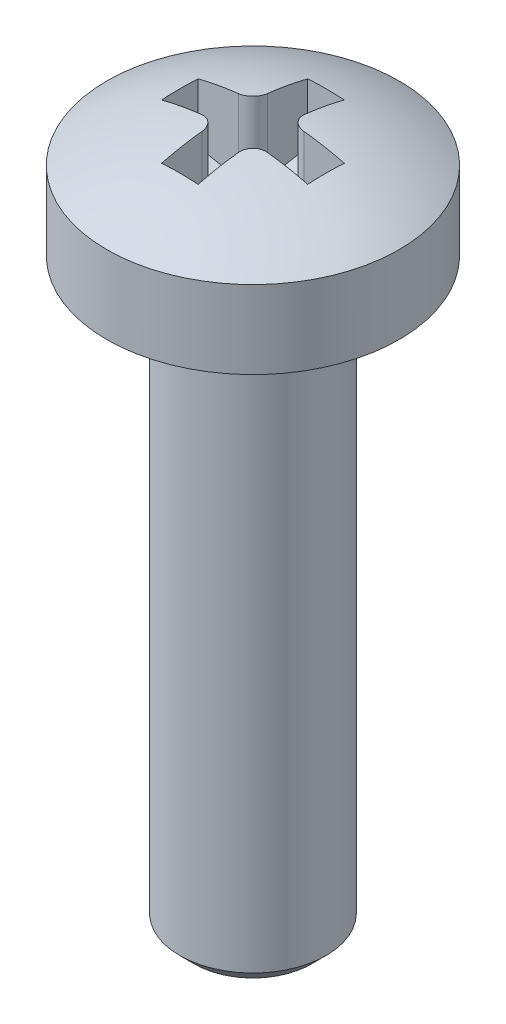
ISO-10303-21;
HEADER;
FILE_DESCRIPTION(('STEP AP214'),'2;1');
FILE_NAME('part.step','',(''),(''),'','','');
FILE_SCHEMA(('AUTOMOTIVE_DESIGN { 1 0 10303 214 1 1 1 1 }'));
ENDSEC;
DATA;
#1=APPLICATION_CONTEXT('core data for automotive mechanical design processes');
#2=APPLICATION_PROTOCOL_DEFINITION('international standard','automotive_design',2000,#1);
#3=PRODUCT_CONTEXT('',#1,'mechanical');
#4=PRODUCT('Part','Part','',(#3));
#5=PRODUCT_RELATED_PRODUCT_CATEGORY('part','',(#4));
#6=PRODUCT_DEFINITION_FORMATION('','',#4);
#7=PRODUCT_DEFINITION_CONTEXT('part definition',#1,'design');
#8=PRODUCT_DEFINITION('design','',#6,#7);
#9=PRODUCT_DEFINITION_SHAPE('','',#8);
#10=(LENGTH_UNIT() NAMED_UNIT(*) SI_UNIT(.MILLI.,.METRE.));
#11=(NAMED_UNIT(*) PLANE_ANGLE_UNIT() SI_UNIT($,.RADIAN.));
#12=(NAMED_UNIT(*) SI_UNIT($,.STERADIAN.) SOLID_ANGLE_UNIT());
#13=UNCERTAINTY_MEASURE_WITH_UNIT(LENGTH_MEASURE(1.E-05),#10,'distance_accuracy_value','');
#14=(GEOMETRIC_REPRESENTATION_CONTEXT(3) GLOBAL_UNCERTAINTY_ASSIGNED_CONTEXT((#13)) GLOBAL_UNIT_ASSIGNED_CONTEXT((#10,
#11,#12)) REPRESENTATION_CONTEXT('',''));
#15=CARTESIAN_POINT('',(0.,0.,0.));
#16=DIRECTION('',(0.,0.,1.));
#17=DIRECTION('',(1.,0.,0.));
#18=AXIS2_PLACEMENT_3D('',#15,#16,#17);
#19=CARTESIAN_POINT('',(1.5,-12.,0.));
#20=DIRECTION('',(0.,1.,0.));
#21=DIRECTION('',(0.,0.,1.));
#22=AXIS2_PLACEMENT_3D('',#19,#20,#21);
#23=PLANE('',#22);
#24=CARTESIAN_POINT('',(0.,-12.,0.));
#25=DIRECTION('',(0.,1.,0.));
#26=DIRECTION('',(0.,0.,1.));
#27=AXIS2_PLACEMENT_3D('',#24,#25,#26);
#28=CIRCLE('',#27,1.2);
#29=CARTESIAN_POINT('',(0.,-12.,1.2));
#30=VERTEX_POINT('',#29);
#31=EDGE_CURVE('E11',#30,#30,#28,.F.);
#32=ORIENTED_EDGE('',*,*,#31,.T.);
#33=EDGE_LOOP('',(#32));
#34=FACE_BOUND('',#33,.T.);
#35=ADVANCED_FACE('F37',(#34),#23,.F.);
#36=CARTESIAN_POINT('',(0.,-3.62500000000001,0.));
#37=DIRECTION('',(0.,1.,0.));
#38=DIRECTION('',(1.,0.,0.));
#39=AXIS2_PLACEMENT_3D('',#36,#37,#38);
#40=SPHERICAL_SURFACE('',#39,6.02500000000001);
#41=CARTESIAN_POINT('',(0.375,-3.62500000000001,0.));
#42=DIRECTION('',(1.,0.,0.));
#43=DIRECTION('',(0.,0.,-1.));
#44=AXIS2_PLACEMENT_3D('',#41,#42,#43);
#45=CIRCLE('',#44,6.01331855134917);
#46=CARTESIAN_POINT('',(0.375,2.19822934461627,-1.5));
#47=VERTEX_POINT('',#46);
#48=CARTESIAN_POINT('',(0.375,2.35031379929121,-0.675));
#49=VERTEX_POINT('',#48);
#50=EDGE_CURVE('E195',#47,#49,#45,.T.);
#51=ORIENTED_EDGE('',*,*,#50,.T.);
#52=CARTESIAN_POINT('',(0.375,2.35031379929121,-0.675));
#53=CARTESIAN_POINT('',(0.374985349417381,2.35220444615528,-0.658277956372581));
#54=CARTESIAN_POINT('',(0.376397398992253,2.35393496074945,-0.641538977654202));
#55=CARTESIAN_POINT('',(0.381987637635008,2.35703276253778,-0.608502344680983));
#56=CARTESIAN_POINT('',(0.386164616673404,2.3584002082569,-0.592204500616442));
#57=CARTESIAN_POINT('',(0.397201767549696,2.36073151910796,-0.560497890339847));
#58=CARTESIAN_POINT('',(0.404063968155696,2.36169507794809,-0.54508980649399));
#59=CARTESIAN_POINT('',(0.420278633306388,2.3631885302197,-0.515627806387893));
#60=CARTESIAN_POINT('',(0.429630327307517,2.36371855763068,-0.501573472947157));
#61=CARTESIAN_POINT('',(0.450489734779432,2.3643271631073,-0.475314136043546));
#62=CARTESIAN_POINT('',(0.461982277261607,2.36440880162246,-0.463097150651167));
#63=CARTESIAN_POINT('',(0.486839207376879,2.36412637906618,-0.440746151760645));
#64=CARTESIAN_POINT('',(0.500203884200747,2.36376224906896,-0.430612460669295));
#65=CARTESIAN_POINT('',(0.528375551845275,2.36260097750676,-0.412742868154042));
#66=CARTESIAN_POINT('',(0.543178165558437,2.36180511820399,-0.40499997225592));
#67=CARTESIAN_POINT('',(0.573836425325766,2.35980454599236,-0.392082493800712));
#68=CARTESIAN_POINT('',(0.589691658381626,2.35859999268216,-0.38690691062456));
#69=CARTESIAN_POINT('',(0.617185195118467,2.35623282056287,-0.380392504975069));
#70=CARTESIAN_POINT('',(0.628674838536786,2.35516432503431,-0.378370330785825));
#71=CARTESIAN_POINT('',(0.651777921121526,2.35286050821514,-0.375673982210861));
#72=CARTESIAN_POINT('',(0.663391159511301,2.35162542794527,-0.374997882148386));
#73=CARTESIAN_POINT('',(0.675,2.35031379929121,-0.375));
#74=B_SPLINE_CURVE_WITH_KNOTS('',3,(#52,#53,#54,#55,#56,#57,#58,#59,#60,#61,#62,#63,#64,#65,#66,
#67,#68,#69,#70,#71,#72,#73),.UNSPECIFIED.,.F.,.F.,(4,2,2,2,2,2,2,2,2,2,4),(0.,
0.0504243081052717,0.100826563352769,0.151266972820674,0.201691788178594,0.251772000476645,
0.30185995727157,0.351799957856257,0.401720478828299,0.436790510548682,0.47181033536791),.UNSPECIFIED.);
#75=CARTESIAN_POINT('',(0.675,2.35031379929121,-0.375));
#76=VERTEX_POINT('',#75);
#77=EDGE_CURVE('E257',#49,#76,#74,.T.);
#78=ORIENTED_EDGE('',*,*,#77,.T.);
#79=CARTESIAN_POINT('',(0.,-3.62500000000001,-0.375));
#80=DIRECTION('',(0.,0.,-1.));
#81=DIRECTION('',(-1.,0.,0.));
#82=AXIS2_PLACEMENT_3D('',#79,#80,#81);
#83=CIRCLE('',#82,6.01331855134917);
#84=CARTESIAN_POINT('',(1.5,2.19822934461627,-0.375));
#85=VERTEX_POINT('',#84);
#86=EDGE_CURVE('E193',#76,#85,#83,.T.);
#87=ORIENTED_EDGE('',*,*,#86,.T.);
#88=CARTESIAN_POINT('',(1.5,-3.62500000000001,0.));
#89=DIRECTION('',(1.,0.,0.));
#90=DIRECTION('',(0.,0.,-1.));
#91=AXIS2_PLACEMENT_3D('',#88,#89,#90);
#92=CIRCLE('',#91,5.83529133805675);
#93=CARTESIAN_POINT('',(1.5,2.19822934461627,0.375));
#94=VERTEX_POINT('',#93);
#95=EDGE_CURVE('E170',#85,#94,#92,.T.);
#96=ORIENTED_EDGE('',*,*,#95,.T.);
#97=CARTESIAN_POINT('',(0.,-3.62500000000001,0.375));
#98=DIRECTION('',(0.,0.,1.));
#99=DIRECTION('',(1.,0.,0.));
#100=AXIS2_PLACEMENT_3D('',#97,#98,#99);
#101=CIRCLE('',#100,6.01331855134917);
#102=CARTESIAN_POINT('',(0.675,2.35031379929121,0.375));
#103=VERTEX_POINT('',#102);
#104=EDGE_CURVE('E219',#94,#103,#101,.T.);
#105=ORIENTED_EDGE('',*,*,#104,.T.);
#106=CARTESIAN_POINT('',(0.675,2.35031379929121,0.375));
#107=CARTESIAN_POINT('',(0.658277956372581,2.35220444615528,0.374985349417381));
#108=CARTESIAN_POINT('',(0.641538977654202,2.35393496074945,0.376397398992254));
#109=CARTESIAN_POINT('',(0.608502344680983,2.35703276253778,0.381987637635009));
#110=CARTESIAN_POINT('',(0.592204500616442,2.3584002082569,0.386164616673404));
#111=CARTESIAN_POINT('',(0.560497890339847,2.36073151910796,0.397201767549697));
#112=CARTESIAN_POINT('',(0.54508980649399,2.36169507794809,0.404063968155696));
#113=CARTESIAN_POINT('',(0.515627806387893,2.3631885302197,0.420278633306388));
#114=CARTESIAN_POINT('',(0.501573472947157,2.36371855763068,0.429630327307518));
#115=CARTESIAN_POINT('',(0.475314136043546,2.3643271631073,0.450489734779433));
#116=CARTESIAN_POINT('',(0.463097150651167,2.36440880162246,0.461982277261608));
#117=CARTESIAN_POINT('',(0.440746151760645,2.36412637906618,0.48683920737688));
#118=CARTESIAN_POINT('',(0.430612460669295,2.36376224906896,0.500203884200747));
#119=CARTESIAN_POINT('',(0.412742868154042,2.36260097750676,0.528375551845275));
#120=CARTESIAN_POINT('',(0.40499997225592,2.36180511820399,0.543178165558437));
#121=CARTESIAN_POINT('',(0.392082493800712,2.35980454599236,0.573836425325766));
#122=CARTESIAN_POINT('',(0.38690691062456,2.35859999268216,0.589691658381626));
#123=CARTESIAN_POINT('',(0.380392504975069,2.35623282056287,0.617185195118467));
#124=CARTESIAN_POINT('',(0.378370330785825,2.35516432503431,0.628674838536786));
#125=CARTESIAN_POINT('',(0.375673982210861,2.35286050821514,0.651777921121527));
#126=CARTESIAN_POINT('',(0.374997882148386,2.35162542794527,0.663391159511301));
#127=CARTESIAN_POINT('',(0.375,2.35031379929121,0.675));
#128=B_SPLINE_CURVE_WITH_KNOTS('',3,(#106,#107,#108,#109,#110,#111,#112,#113,#114,#115,#116,
#117,#118,#119,#120,#121,#122,#123,#124,#125,#126,#127),.UNSPECIFIED.,.F.,.F.,(4,2,2,2,2,2,2,2,
2,2,4),(0.,0.0504243081052716,0.100826563352769,0.151266972820674,0.201691788178594,
0.251772000476645,0.30185995727157,0.351799957856257,0.401720478828299,0.436790510548682,
0.47181033536791),.UNSPECIFIED.);
#129=CARTESIAN_POINT('',(0.375,2.35031379929121,0.675));
#130=VERTEX_POINT('',#129);
#131=EDGE_CURVE('E252',#103,#130,#128,.T.);
#132=ORIENTED_EDGE('',*,*,#131,.T.);
#133=CARTESIAN_POINT('',(0.375,-3.62500000000001,0.));
#134=DIRECTION('',(1.,0.,0.));
#135=DIRECTION('',(0.,0.,-1.));
#136=AXIS2_PLACEMENT_3D('',#133,#134,#135);
#137=CIRCLE('',#136,6.01331855134917);
#138=CARTESIAN_POINT('',(0.375,2.19822934461627,1.5));
#139=VERTEX_POINT('',#138);
#140=EDGE_CURVE('E217',#130,#139,#137,.T.);
#141=ORIENTED_EDGE('',*,*,#140,.T.);
#142=CARTESIAN_POINT('',(0.,-3.62500000000001,1.5));
#143=DIRECTION('',(0.,0.,1.));
#144=DIRECTION('',(1.,0.,0.));
#145=AXIS2_PLACEMENT_3D('',#142,#143,#144);
#146=CIRCLE('',#145,5.83529133805675);
#147=CARTESIAN_POINT('',(-0.375,2.19822934461627,1.5));
#148=VERTEX_POINT('',#147);
#149=EDGE_CURVE('E214',#139,#148,#146,.T.);
#150=ORIENTED_EDGE('',*,*,#149,.T.);
#151=CARTESIAN_POINT('',(-0.375,-3.62500000000001,0.));
#152=DIRECTION('',(-1.,0.,0.));
#153=DIRECTION('',(0.,0.,1.));
#154=AXIS2_PLACEMENT_3D('',#151,#152,#153);
#155=CIRCLE('',#154,6.01331855134917);
#156=CARTESIAN_POINT('',(-0.375,2.35031379929121,0.675));
#157=VERTEX_POINT('',#156);
#158=EDGE_CURVE('E211',#148,#157,#155,.T.);
#159=ORIENTED_EDGE('',*,*,#158,.T.);
#160=CARTESIAN_POINT('',(-0.375,2.35031379929121,0.675));
#161=CARTESIAN_POINT('',(-0.374985349417381,2.35220444615528,0.658277956372581));
#162=CARTESIAN_POINT('',(-0.376397398992254,2.35393496074945,0.641538977654203));
#163=CARTESIAN_POINT('',(-0.381987637635009,2.35703276253778,0.608502344680983));
#164=CARTESIAN_POINT('',(-0.386164616673404,2.3584002082569,0.592204500616442));
#165=CARTESIAN_POINT('',(-0.397201767549697,2.36073151910796,0.560497890339847));
#166=CARTESIAN_POINT('',(-0.404063968155696,2.36169507794809,0.545089806493991));
#167=CARTESIAN_POINT('',(-0.420278633306388,2.3631885302197,0.515627806387893));
#168=CARTESIAN_POINT('',(-0.429630327307518,2.36371855763068,0.501573472947157));
#169=CARTESIAN_POINT('',(-0.450489734779433,2.3643271631073,0.475314136043547));
#170=CARTESIAN_POINT('',(-0.461982277261608,2.36440880162246,0.463097150651168));
#171=CARTESIAN_POINT('',(-0.48683920737688,2.36412637906618,0.440746151760645));
#172=CARTESIAN_POINT('',(-0.500203884200747,2.36376224906896,0.430612460669295));
#173=CARTESIAN_POINT('',(-0.528375551845275,2.36260097750676,0.412742868154042));
#174=CARTESIAN_POINT('',(-0.543178165558437,2.36180511820399,0.40499997225592));
#175=CARTESIAN_POINT('',(-0.573836425325766,2.35980454599236,0.392082493800713));
#176=CARTESIAN_POINT('',(-0.589691658381626,2.35859999268216,0.38690691062456));
#177=CARTESIAN_POINT('',(-0.617185195118467,2.35623282056287,0.380392504975069));
#178=CARTESIAN_POINT('',(-0.628674838536786,2.35516432503431,0.378370330785826));
#179=CARTESIAN_POINT('',(-0.651777921121527,2.35286050821514,0.375673982210861));
#180=CARTESIAN_POINT('',(-0.663391159511301,2.35162542794527,0.374997882148387));
#181=CARTESIAN_POINT('',(-0.675,2.35031379929121,0.375));
#182=B_SPLINE_CURVE_WITH_KNOTS('',3,(#160,#161,#162,#163,#164,#165,#166,#167,#168,#169,#170,
#171,#172,#173,#174,#175,#176,#177,#178,#179,#180,#181),.UNSPECIFIED.,.F.,.F.,(4,2,2,2,2,2,2,2,
2,2,4),(0.,0.0504243081052716,0.100826563352769,0.151266972820674,0.201691788178594,
0.251772000476645,0.30185995727157,0.351799957856257,0.401720478828299,0.436790510548682,
0.47181033536791),.UNSPECIFIED.);
#183=CARTESIAN_POINT('',(-0.675,2.35031379929121,0.375));
#184=VERTEX_POINT('',#183);
#185=EDGE_CURVE('E231',#157,#184,#182,.T.);
#186=ORIENTED_EDGE('',*,*,#185,.T.);
#187=CARTESIAN_POINT('',(0.,-3.62500000000001,0.375));
#188=DIRECTION('',(0.,0.,1.));
#189=DIRECTION('',(1.,0.,0.));
#190=AXIS2_PLACEMENT_3D('',#187,#188,#189);
#191=CIRCLE('',#190,6.01331855134917);
#192=CARTESIAN_POINT('',(-1.5,2.19822934461627,0.375));
#193=VERTEX_POINT('',#192);
#194=EDGE_CURVE('E209',#184,#193,#191,.T.);
#195=ORIENTED_EDGE('',*,*,#194,.T.);
#196=CARTESIAN_POINT('',(-1.5,-3.62500000000001,0.));
#197=DIRECTION('',(-1.,0.,0.));
#198=DIRECTION('',(0.,0.,1.));
#199=AXIS2_PLACEMENT_3D('',#196,#197,#198);
#200=CIRCLE('',#199,5.83529133805675);
#201=CARTESIAN_POINT('',(-1.5,2.19822934461627,-0.375));
#202=VERTEX_POINT('',#201);
#203=EDGE_CURVE('E206',#193,#202,#200,.T.);
#204=ORIENTED_EDGE('',*,*,#203,.T.);
#205=CARTESIAN_POINT('',(0.,-3.62500000000001,-0.375));
#206=DIRECTION('',(0.,0.,-1.));
#207=DIRECTION('',(-1.,0.,0.));
#208=AXIS2_PLACEMENT_3D('',#205,#206,#207);
#209=CIRCLE('',#208,6.01331855134917);
#210=CARTESIAN_POINT('',(-0.675,2.35031379929121,-0.375));
#211=VERTEX_POINT('',#210);
#212=EDGE_CURVE('E203',#202,#211,#209,.T.);
#213=ORIENTED_EDGE('',*,*,#212,.T.);
#214=CARTESIAN_POINT('',(-0.675,2.35031379929121,-0.375));
#215=CARTESIAN_POINT('',(-0.658277956372581,2.35220444615528,-0.374985349417381));
#216=CARTESIAN_POINT('',(-0.641538977654203,2.35393496074945,-0.376397398992253));
#217=CARTESIAN_POINT('',(-0.608502344680983,2.35703276253778,-0.381987637635008));
#218=CARTESIAN_POINT('',(-0.592204500616442,2.3584002082569,-0.386164616673404));
#219=CARTESIAN_POINT('',(-0.560497890339847,2.36073151910796,-0.397201767549696));
#220=CARTESIAN_POINT('',(-0.545089806493991,2.36169507794809,-0.404063968155695));
#221=CARTESIAN_POINT('',(-0.515627806387893,2.3631885302197,-0.420278633306388));
#222=CARTESIAN_POINT('',(-0.501573472947157,2.36371855763068,-0.429630327307517));
#223=CARTESIAN_POINT('',(-0.475314136043547,2.3643271631073,-0.450489734779432));
#224=CARTESIAN_POINT('',(-0.463097150651168,2.36440880162246,-0.461982277261607));
#225=CARTESIAN_POINT('',(-0.440746151760646,2.36412637906618,-0.486839207376879));
#226=CARTESIAN_POINT('',(-0.430612460669295,2.36376224906896,-0.500203884200747));
#227=CARTESIAN_POINT('',(-0.412742868154042,2.36260097750676,-0.528375551845275));
#228=CARTESIAN_POINT('',(-0.40499997225592,2.36180511820399,-0.543178165558437));
#229=CARTESIAN_POINT('',(-0.392082493800713,2.35980454599236,-0.573836425325766));
#230=CARTESIAN_POINT('',(-0.38690691062456,2.35859999268216,-0.589691658381626));
#231=CARTESIAN_POINT('',(-0.380392504975069,2.35623282056287,-0.617185195118466));
#232=CARTESIAN_POINT('',(-0.378370330785826,2.35516432503431,-0.628674838536786));
#233=CARTESIAN_POINT('',(-0.375673982210861,2.35286050821514,-0.651777921121526));
#234=CARTESIAN_POINT('',(-0.374997882148387,2.35162542794527,-0.6633911595113));
#235=CARTESIAN_POINT('',(-0.375,2.35031379929121,-0.675));
#236=B_SPLINE_CURVE_WITH_KNOTS('',3,(#214,#215,#216,#217,#218,#219,#220,#221,#222,#223,#224,
#225,#226,#227,#228,#229,#230,#231,#232,#233,#234,#235),.UNSPECIFIED.,.F.,.F.,(4,2,2,2,2,2,2,2,
2,2,4),(0.,0.0504243081052717,0.100826563352769,0.151266972820674,0.201691788178594,
0.251772000476645,0.30185995727157,0.351799957856257,0.401720478828299,0.436790510548682,
0.47181033536791),.UNSPECIFIED.);
#237=CARTESIAN_POINT('',(-0.375,2.35031379929121,-0.675));
#238=VERTEX_POINT('',#237);
#239=EDGE_CURVE('E225',#211,#238,#236,.T.);
#240=ORIENTED_EDGE('',*,*,#239,.T.);
#241=CARTESIAN_POINT('',(-0.375,-3.62500000000001,0.));
#242=DIRECTION('',(-1.,0.,0.));
#243=DIRECTION('',(0.,0.,1.));
#244=AXIS2_PLACEMENT_3D('',#241,#242,#243);
#245=CIRCLE('',#244,6.01331855134917);
#246=CARTESIAN_POINT('',(-0.375,2.19822934461627,-1.5));
#247=VERTEX_POINT('',#246);
#248=EDGE_CURVE('E201',#238,#247,#245,.T.);
#249=ORIENTED_EDGE('',*,*,#248,.T.);
#250=CARTESIAN_POINT('',(0.,-3.62500000000001,-1.5));
#251=DIRECTION('',(0.,0.,-1.));
#252=DIRECTION('',(-1.,0.,0.));
#253=AXIS2_PLACEMENT_3D('',#250,#251,#252);
#254=CIRCLE('',#253,5.83529133805675);
#255=EDGE_CURVE('E198',#247,#47,#254,.T.);
#256=ORIENTED_EDGE('',*,*,#255,.T.);
#257=EDGE_LOOP('',(#51,#78,#87,#96,#105,#132,#141,#150,#159,#186,#195,#204,#213,#240,#249,#256));
#258=FACE_BOUND('',#257,.T.);
#259=CARTESIAN_POINT('',(0.,1.6,0.));
#260=DIRECTION('',(0.,1.,0.));
#261=DIRECTION('',(0.,0.,1.));
#262=AXIS2_PLACEMENT_3D('',#259,#260,#261);
#263=CIRCLE('',#262,3.);
#264=CARTESIAN_POINT('',(0.,1.6,3.));
#265=VERTEX_POINT('',#264);
#266=EDGE_CURVE('E189',#265,#265,#263,.T.);
#267=ORIENTED_EDGE('',*,*,#266,.T.);
#268=EDGE_LOOP('',(#267));
#269=FACE_BOUND('',#268,.T.);
#270=ADVANCED_FACE('F239',(#258,#269),#40,.T.);
#271=CARTESIAN_POINT('',(0.,2.4,0.));
#272=DIRECTION('',(0.,1.,0.));
#273=DIRECTION('',(0.,0.,1.));
#274=AXIS2_PLACEMENT_3D('',#271,#272,#273);
#275=CYLINDRICAL_SURFACE('',#274,3.);
#276=ORIENTED_EDGE('',*,*,#266,.F.);
#277=EDGE_LOOP('',(#276));
#278=FACE_BOUND('',#277,.T.);
#279=CARTESIAN_POINT('',(0.,0.,0.));
#280=DIRECTION('',(0.,1.,0.));
#281=DIRECTION('',(0.,0.,1.));
#282=AXIS2_PLACEMENT_3D('',#279,#280,#281);
#283=CIRCLE('',#282,3.);
#284=CARTESIAN_POINT('',(0.,0.,3.));
#285=VERTEX_POINT('',#284);
#286=EDGE_CURVE('E181',#285,#285,#283,.T.);
#287=ORIENTED_EDGE('',*,*,#286,.T.);
#288=EDGE_LOOP('',(#287));
#289=FACE_BOUND('',#288,.T.);
#290=ADVANCED_FACE('F244',(#278,#289),#275,.T.);
#291=CARTESIAN_POINT('',(3.,0.,0.));
#292=DIRECTION('',(0.,1.,0.));
#293=DIRECTION('',(0.,0.,1.));
#294=AXIS2_PLACEMENT_3D('',#291,#292,#293);
#295=PLANE('',#294);
#296=ORIENTED_EDGE('',*,*,#286,.F.);
#297=EDGE_LOOP('',(#296));
#298=FACE_BOUND('',#297,.T.);
#299=CARTESIAN_POINT('',(0.,0.,0.));
#300=DIRECTION('',(0.,1.,0.));
#301=DIRECTION('',(0.,0.,1.));
#302=AXIS2_PLACEMENT_3D('',#299,#300,#301);
#303=CIRCLE('',#302,1.5);
#304=CARTESIAN_POINT('',(0.,0.,1.5));
#305=VERTEX_POINT('',#304);
#306=EDGE_CURVE('E178',#305,#305,#303,.T.);
#307=ORIENTED_EDGE('',*,*,#306,.T.);
#308=EDGE_LOOP('',(#307));
#309=FACE_BOUND('',#308,.T.);
#310=ADVANCED_FACE('F331',(#298,#309),#295,.F.);
#311=CARTESIAN_POINT('',(0.,2.4,0.));
#312=DIRECTION('',(0.,1.,0.));
#313=DIRECTION('',(0.,0.,1.));
#314=AXIS2_PLACEMENT_3D('',#311,#312,#313);
#315=CYLINDRICAL_SURFACE('',#314,1.5);
#316=CARTESIAN_POINT('',(0.,-11.7,0.));
#317=DIRECTION('',(0.,1.,0.));
#318=DIRECTION('',(0.,0.,1.));
#319=AXIS2_PLACEMENT_3D('',#316,#317,#318);
#320=CIRCLE('',#319,1.5);
#321=CARTESIAN_POINT('',(0.,-11.7,1.5));
#322=VERTEX_POINT('',#321);
#323=EDGE_CURVE('E45',#322,#322,#320,.T.);
#324=ORIENTED_EDGE('',*,*,#323,.T.);
#325=EDGE_LOOP('',(#324));
#326=FACE_BOUND('',#325,.T.);
#327=ORIENTED_EDGE('',*,*,#306,.F.);
#328=EDGE_LOOP('',(#327));
#329=FACE_BOUND('',#328,.T.);
#330=ADVANCED_FACE('F303',(#326,#329),#315,.T.);
#331=CARTESIAN_POINT('',(0.375,-12.001,0.375));
#332=DIRECTION('',(0.,0.,1.));
#333=DIRECTION('',(1.,0.,0.));
#334=AXIS2_PLACEMENT_3D('',#331,#332,#333);
#335=PLANE('',#334);
#336=CARTESIAN_POINT('',(0.,6.82500000000003,0.375));
#337=DIRECTION('',(0.,0.,1.));
#338=DIRECTION('',(1.,0.,0.));
#339=AXIS2_PLACEMENT_3D('',#336,#337,#338);
#340=CIRCLE('',#339,6.01331855134919);
#341=CARTESIAN_POINT('',(1.5,1.00177065538373,0.375));
#342=VERTEX_POINT('',#341);
#343=CARTESIAN_POINT('',(0.675,0.849686200708785,0.375));
#344=VERTEX_POINT('',#343);
#345=EDGE_CURVE('E176',#342,#344,#340,.F.);
#346=ORIENTED_EDGE('',*,*,#345,.T.);
#347=DIRECTION('',(0.,1.,0.));
#348=VECTOR('',#347,1.);
#349=CARTESIAN_POINT('',(0.675,-12.001,0.375));
#350=LINE('',#349,#348);
#351=EDGE_CURVE('E556',#344,#103,#350,.T.);
#352=ORIENTED_EDGE('',*,*,#351,.T.);
#353=ORIENTED_EDGE('',*,*,#104,.F.);
#354=DIRECTION('',(0.,1.,0.));
#355=VECTOR('',#354,1.);
#356=CARTESIAN_POINT('',(1.5,-12.001,0.375));
#357=LINE('',#356,#355);
#358=EDGE_CURVE('E172',#342,#94,#357,.T.);
#359=ORIENTED_EDGE('',*,*,#358,.F.);
#360=EDGE_LOOP('',(#346,#352,#353,#359));
#361=FACE_BOUND('',#360,.T.);
#362=ADVANCED_FACE('F344',(#361),#335,.F.);
#363=CARTESIAN_POINT('',(0.375,-12.001,0.375));
#364=DIRECTION('',(1.,0.,0.));
#365=DIRECTION('',(0.,0.,-1.));
#366=AXIS2_PLACEMENT_3D('',#363,#364,#365);
#367=PLANE('',#366);
#368=ORIENTED_EDGE('',*,*,#140,.F.);
#369=DIRECTION('',(0.,1.,0.));
#370=VECTOR('',#369,1.);
#371=CARTESIAN_POINT('',(0.375,-12.001,0.675));
#372=LINE('',#371,#370);
#373=CARTESIAN_POINT('',(0.375,0.849686200708785,0.675));
#374=VERTEX_POINT('',#373);
#375=EDGE_CURVE('E554',#130,#374,#372,.F.);
#376=ORIENTED_EDGE('',*,*,#375,.T.);
#377=CARTESIAN_POINT('',(0.375,6.82500000000003,0.));
#378=DIRECTION('',(1.,0.,0.));
#379=DIRECTION('',(0.,0.,-1.));
#380=AXIS2_PLACEMENT_3D('',#377,#378,#379);
#381=CIRCLE('',#380,6.01331855134919);
#382=CARTESIAN_POINT('',(0.375,1.00177065538373,1.5));
#383=VERTEX_POINT('',#382);
#384=EDGE_CURVE('E183',#374,#383,#381,.F.);
#385=ORIENTED_EDGE('',*,*,#384,.T.);
#386=DIRECTION('',(0.,1.,0.));
#387=VECTOR('',#386,1.);
#388=CARTESIAN_POINT('',(0.375,-12.001,1.5));
#389=LINE('',#388,#387);
#390=EDGE_CURVE('E162',#383,#139,#389,.T.);
#391=ORIENTED_EDGE('',*,*,#390,.T.);
#392=EDGE_LOOP('',(#368,#376,#385,#391));
#393=FACE_BOUND('',#392,.T.);
#394=ADVANCED_FACE('F292',(#393),#367,.F.);
#395=CARTESIAN_POINT('',(-0.375,-12.001,1.5));
#396=DIRECTION('',(0.,0.,1.));
#397=DIRECTION('',(1.,0.,0.));
#398=AXIS2_PLACEMENT_3D('',#395,#396,#397);
#399=PLANE('',#398);
#400=ORIENTED_EDGE('',*,*,#390,.F.);
#401=CARTESIAN_POINT('',(0.,6.82500000000003,1.5));
#402=DIRECTION('',(0.,0.,1.));
#403=DIRECTION('',(1.,0.,0.));
#404=AXIS2_PLACEMENT_3D('',#401,#402,#403);
#405=CIRCLE('',#404,5.83529133805677);
#406=CARTESIAN_POINT('',(-0.375,1.00177065538373,1.5));
#407=VERTEX_POINT('',#406);
#408=EDGE_CURVE('E518',#383,#407,#405,.F.);
#409=ORIENTED_EDGE('',*,*,#408,.T.);
#410=DIRECTION('',(0.,1.,0.));
#411=VECTOR('',#410,1.);
#412=CARTESIAN_POINT('',(-0.375,-12.001,1.5));
#413=LINE('',#412,#411);
#414=EDGE_CURVE('E517',#407,#148,#413,.T.);
#415=ORIENTED_EDGE('',*,*,#414,.T.);
#416=ORIENTED_EDGE('',*,*,#149,.F.);
#417=EDGE_LOOP('',(#400,#409,#415,#416));
#418=FACE_BOUND('',#417,.T.);
#419=ADVANCED_FACE('F357',(#418),#399,.F.);
#420=CARTESIAN_POINT('',(-0.375,-12.001,0.375));
#421=DIRECTION('',(-1.,0.,0.));
#422=DIRECTION('',(0.,0.,1.));
#423=AXIS2_PLACEMENT_3D('',#420,#421,#422);
#424=PLANE('',#423);
#425=CARTESIAN_POINT('',(-0.375,6.82500000000003,0.));
#426=DIRECTION('',(-1.,0.,0.));
#427=DIRECTION('',(0.,0.,1.));
#428=AXIS2_PLACEMENT_3D('',#425,#426,#427);
#429=CIRCLE('',#428,6.01331855134919);
#430=CARTESIAN_POINT('',(-0.375,0.849686200708785,0.675));
#431=VERTEX_POINT('',#430);
#432=EDGE_CURVE('E512',#407,#431,#429,.F.);
#433=ORIENTED_EDGE('',*,*,#432,.T.);
#434=DIRECTION('',(0.,1.,0.));
#435=VECTOR('',#434,1.);
#436=CARTESIAN_POINT('',(-0.375,-12.001,0.675));
#437=LINE('',#436,#435);
#438=EDGE_CURVE('E507',#431,#157,#437,.T.);
#439=ORIENTED_EDGE('',*,*,#438,.T.);
#440=ORIENTED_EDGE('',*,*,#158,.F.);
#441=ORIENTED_EDGE('',*,*,#414,.F.);
#442=EDGE_LOOP('',(#433,#439,#440,#441));
#443=FACE_BOUND('',#442,.T.);
#444=ADVANCED_FACE('F364',(#443),#424,.F.);
#445=CARTESIAN_POINT('',(-1.5,-12.001,0.375));
#446=DIRECTION('',(0.,0.,1.));
#447=DIRECTION('',(1.,0.,0.));
#448=AXIS2_PLACEMENT_3D('',#445,#446,#447);
#449=PLANE('',#448);
#450=ORIENTED_EDGE('',*,*,#194,.F.);
#451=DIRECTION('',(0.,1.,0.));
#452=VECTOR('',#451,1.);
#453=CARTESIAN_POINT('',(-0.675,-12.001,0.375));
#454=LINE('',#453,#452);
#455=CARTESIAN_POINT('',(-0.675,0.849686200708785,0.375));
#456=VERTEX_POINT('',#455);
#457=EDGE_CURVE('E505',#184,#456,#454,.F.);
#458=ORIENTED_EDGE('',*,*,#457,.T.);
#459=CARTESIAN_POINT('',(0.,6.82500000000003,0.375));
#460=DIRECTION('',(0.,0.,1.));
#461=DIRECTION('',(1.,0.,0.));
#462=AXIS2_PLACEMENT_3D('',#459,#460,#461);
#463=CIRCLE('',#462,6.01331855134919);
#464=CARTESIAN_POINT('',(-1.5,1.00177065538373,0.375));
#465=VERTEX_POINT('',#464);
#466=EDGE_CURVE('E515',#456,#465,#463,.F.);
#467=ORIENTED_EDGE('',*,*,#466,.T.);
#468=DIRECTION('',(0.,1.,0.));
#469=VECTOR('',#468,1.);
#470=CARTESIAN_POINT('',(-1.5,-12.001,0.375));
#471=LINE('',#470,#469);
#472=EDGE_CURVE('E529',#465,#193,#471,.T.);
#473=ORIENTED_EDGE('',*,*,#472,.T.);
#474=EDGE_LOOP('',(#450,#458,#467,#473));
#475=FACE_BOUND('',#474,.T.);
#476=ADVANCED_FACE('F371',(#475),#449,.F.);
#477=CARTESIAN_POINT('',(-1.5,-12.001,-0.375));
#478=DIRECTION('',(-1.,0.,0.));
#479=DIRECTION('',(0.,0.,1.));
#480=AXIS2_PLACEMENT_3D('',#477,#478,#479);
#481=PLANE('',#480);
#482=ORIENTED_EDGE('',*,*,#472,.F.);
#483=CARTESIAN_POINT('',(-1.5,6.82500000000003,0.));
#484=DIRECTION('',(-1.,0.,0.));
#485=DIRECTION('',(0.,0.,1.));
#486=AXIS2_PLACEMENT_3D('',#483,#484,#485);
#487=CIRCLE('',#486,5.83529133805677);
#488=CARTESIAN_POINT('',(-1.5,1.00177065538373,-0.375));
#489=VERTEX_POINT('',#488);
#490=EDGE_CURVE('E521',#465,#489,#487,.F.);
#491=ORIENTED_EDGE('',*,*,#490,.T.);
#492=DIRECTION('',(0.,1.,0.));
#493=VECTOR('',#492,1.);
#494=CARTESIAN_POINT('',(-1.5,-12.001,-0.375));
#495=LINE('',#494,#493);
#496=EDGE_CURVE('E532',#489,#202,#495,.T.);
#497=ORIENTED_EDGE('',*,*,#496,.T.);
#498=ORIENTED_EDGE('',*,*,#203,.F.);
#499=EDGE_LOOP('',(#482,#491,#497,#498));
#500=FACE_BOUND('',#499,.T.);
#501=ADVANCED_FACE('F379',(#500),#481,.F.);
#502=CARTESIAN_POINT('',(-1.5,-12.001,-0.375));
#503=DIRECTION('',(0.,0.,-1.));
#504=DIRECTION('',(-1.,0.,0.));
#505=AXIS2_PLACEMENT_3D('',#502,#503,#504);
#506=PLANE('',#505);
#507=CARTESIAN_POINT('',(0.,6.82500000000003,-0.375));
#508=DIRECTION('',(0.,0.,-1.));
#509=DIRECTION('',(-1.,0.,0.));
#510=AXIS2_PLACEMENT_3D('',#507,#508,#509);
#511=CIRCLE('',#510,6.01331855134919);
#512=CARTESIAN_POINT('',(-0.675,0.849686200708785,-0.375));
#513=VERTEX_POINT('',#512);
#514=EDGE_CURVE('E564',#489,#513,#511,.F.);
#515=ORIENTED_EDGE('',*,*,#514,.T.);
#516=DIRECTION('',(0.,1.,0.));
#517=VECTOR('',#516,1.);
#518=CARTESIAN_POINT('',(-0.675,-12.001,-0.375));
#519=LINE('',#518,#517);
#520=EDGE_CURVE('E549',#513,#211,#519,.T.);
#521=ORIENTED_EDGE('',*,*,#520,.T.);
#522=ORIENTED_EDGE('',*,*,#212,.F.);
#523=ORIENTED_EDGE('',*,*,#496,.F.);
#524=EDGE_LOOP('',(#515,#521,#522,#523));
#525=FACE_BOUND('',#524,.T.);
#526=ADVANCED_FACE('F387',(#525),#506,.F.);
#527=CARTESIAN_POINT('',(-0.375,-12.001,-1.5));
#528=DIRECTION('',(-1.,0.,0.));
#529=DIRECTION('',(0.,0.,1.));
#530=AXIS2_PLACEMENT_3D('',#527,#528,#529);
#531=PLANE('',#530);
#532=ORIENTED_EDGE('',*,*,#248,.F.);
#533=DIRECTION('',(0.,1.,0.));
#534=VECTOR('',#533,1.);
#535=CARTESIAN_POINT('',(-0.375,-12.001,-0.675));
#536=LINE('',#535,#534);
#537=CARTESIAN_POINT('',(-0.375,0.849686200708785,-0.675));
#538=VERTEX_POINT('',#537);
#539=EDGE_CURVE('E52',#238,#538,#536,.F.);
#540=ORIENTED_EDGE('',*,*,#539,.T.);
#541=CARTESIAN_POINT('',(-0.375,6.82500000000003,0.));
#542=DIRECTION('',(-1.,0.,0.));
#543=DIRECTION('',(0.,0.,1.));
#544=AXIS2_PLACEMENT_3D('',#541,#542,#543);
#545=CIRCLE('',#544,6.01331855134919);
#546=CARTESIAN_POINT('',(-0.375,1.00177065538373,-1.5));
#547=VERTEX_POINT('',#546);
#548=EDGE_CURVE('E560',#538,#547,#545,.F.);
#549=ORIENTED_EDGE('',*,*,#548,.T.);
#550=DIRECTION('',(0.,1.,0.));
#551=VECTOR('',#550,1.);
#552=CARTESIAN_POINT('',(-0.375,-12.001,-1.5));
#553=LINE('',#552,#551);
#554=EDGE_CURVE('E535',#547,#247,#553,.T.);
#555=ORIENTED_EDGE('',*,*,#554,.T.);
#556=EDGE_LOOP('',(#532,#540,#549,#555));
#557=FACE_BOUND('',#556,.T.);
#558=ADVANCED_FACE('F395',(#557),#531,.F.);
#559=CARTESIAN_POINT('',(-0.375,-12.001,-1.5));
#560=DIRECTION('',(0.,0.,-1.));
#561=DIRECTION('',(-1.,0.,0.));
#562=AXIS2_PLACEMENT_3D('',#559,#560,#561);
#563=PLANE('',#562);
#564=ORIENTED_EDGE('',*,*,#554,.F.);
#565=CARTESIAN_POINT('',(0.,6.82500000000003,-1.5));
#566=DIRECTION('',(0.,0.,-1.));
#567=DIRECTION('',(-1.,0.,0.));
#568=AXIS2_PLACEMENT_3D('',#565,#566,#567);
#569=CIRCLE('',#568,5.83529133805677);
#570=CARTESIAN_POINT('',(0.375,1.00177065538373,-1.5));
#571=VERTEX_POINT('',#570);
#572=EDGE_CURVE('E543',#547,#571,#569,.F.);
#573=ORIENTED_EDGE('',*,*,#572,.T.);
#574=DIRECTION('',(0.,1.,0.));
#575=VECTOR('',#574,1.);
#576=CARTESIAN_POINT('',(0.375,-12.001,-1.5));
#577=LINE('',#576,#575);
#578=EDGE_CURVE('E171',#571,#47,#577,.T.);
#579=ORIENTED_EDGE('',*,*,#578,.T.);
#580=ORIENTED_EDGE('',*,*,#255,.F.);
#581=EDGE_LOOP('',(#564,#573,#579,#580));
#582=FACE_BOUND('',#581,.T.);
#583=ADVANCED_FACE('F403',(#582),#563,.F.);
#584=CARTESIAN_POINT('',(0.375,-12.001,-1.5));
#585=DIRECTION('',(1.,0.,0.));
#586=DIRECTION('',(0.,0.,-1.));
#587=AXIS2_PLACEMENT_3D('',#584,#585,#586);
#588=PLANE('',#587);
#589=CARTESIAN_POINT('',(0.375,6.82500000000003,0.));
#590=DIRECTION('',(1.,0.,0.));
#591=DIRECTION('',(0.,0.,-1.));
#592=AXIS2_PLACEMENT_3D('',#589,#590,#591);
#593=CIRCLE('',#592,6.01331855134919);
#594=CARTESIAN_POINT('',(0.375,0.849686200708785,-0.675));
#595=VERTEX_POINT('',#594);
#596=EDGE_CURVE('E161',#571,#595,#593,.F.);
#597=ORIENTED_EDGE('',*,*,#596,.T.);
#598=DIRECTION('',(0.,1.,0.));
#599=VECTOR('',#598,1.);
#600=CARTESIAN_POINT('',(0.375,-12.001,-0.675));
#601=LINE('',#600,#599);
#602=EDGE_CURVE('E222',#595,#49,#601,.T.);
#603=ORIENTED_EDGE('',*,*,#602,.T.);
#604=ORIENTED_EDGE('',*,*,#50,.F.);
#605=ORIENTED_EDGE('',*,*,#578,.F.);
#606=EDGE_LOOP('',(#597,#603,#604,#605));
#607=FACE_BOUND('',#606,.T.);
#608=ADVANCED_FACE('F410',(#607),#588,.F.);
#609=CARTESIAN_POINT('',(0.375,-12.001,-0.375));
#610=DIRECTION('',(0.,0.,-1.));
#611=DIRECTION('',(-1.,0.,0.));
#612=AXIS2_PLACEMENT_3D('',#609,#610,#611);
#613=PLANE('',#612);
#614=ORIENTED_EDGE('',*,*,#86,.F.);
#615=DIRECTION('',(0.,1.,0.));
#616=VECTOR('',#615,1.);
#617=CARTESIAN_POINT('',(0.675,-12.001,-0.375));
#618=LINE('',#617,#616);
#619=CARTESIAN_POINT('',(0.675,0.849686200708785,-0.375));
#620=VERTEX_POINT('',#619);
#621=EDGE_CURVE('E158',#76,#620,#618,.F.);
#622=ORIENTED_EDGE('',*,*,#621,.T.);
#623=CARTESIAN_POINT('',(0.,6.82500000000003,-0.375));
#624=DIRECTION('',(0.,0.,-1.));
#625=DIRECTION('',(-1.,0.,0.));
#626=AXIS2_PLACEMENT_3D('',#623,#624,#625);
#627=CIRCLE('',#626,6.01331855134919);
#628=CARTESIAN_POINT('',(1.5,1.00177065538373,-0.375));
#629=VERTEX_POINT('',#628);
#630=EDGE_CURVE('E152',#620,#629,#627,.F.);
#631=ORIENTED_EDGE('',*,*,#630,.T.);
#632=DIRECTION('',(0.,1.,0.));
#633=VECTOR('',#632,1.);
#634=CARTESIAN_POINT('',(1.5,-12.001,-0.375));
#635=LINE('',#634,#633);
#636=EDGE_CURVE('E156',#629,#85,#635,.T.);
#637=ORIENTED_EDGE('',*,*,#636,.T.);
#638=EDGE_LOOP('',(#614,#622,#631,#637));
#639=FACE_BOUND('',#638,.T.);
#640=ADVANCED_FACE('F155',(#639),#613,.F.);
#641=CARTESIAN_POINT('',(1.5,-12.001,-0.375));
#642=DIRECTION('',(1.,0.,0.));
#643=DIRECTION('',(0.,0.,-1.));
#644=AXIS2_PLACEMENT_3D('',#641,#642,#643);
#645=PLANE('',#644);
#646=ORIENTED_EDGE('',*,*,#636,.F.);
#647=CARTESIAN_POINT('',(1.5,6.82500000000003,0.));
#648=DIRECTION('',(1.,0.,0.));
#649=DIRECTION('',(0.,0.,-1.));
#650=AXIS2_PLACEMENT_3D('',#647,#648,#649);
#651=CIRCLE('',#650,5.83529133805677);
#652=EDGE_CURVE('E167',#629,#342,#651,.F.);
#653=ORIENTED_EDGE('',*,*,#652,.T.);
#654=ORIENTED_EDGE('',*,*,#358,.T.);
#655=ORIENTED_EDGE('',*,*,#95,.F.);
#656=EDGE_LOOP('',(#646,#653,#654,#655));
#657=FACE_BOUND('',#656,.T.);
#658=ADVANCED_FACE('F166',(#657),#645,.F.);
#659=CARTESIAN_POINT('',(0.,6.82500000000003,0.));
#660=DIRECTION('',(0.,1.,0.));
#661=DIRECTION('',(1.,0.,0.));
#662=AXIS2_PLACEMENT_3D('',#659,#660,#661);
#663=SPHERICAL_SURFACE('',#662,6.02500000000003);
#664=ORIENTED_EDGE('',*,*,#345,.F.);
#665=ORIENTED_EDGE('',*,*,#652,.F.);
#666=ORIENTED_EDGE('',*,*,#630,.F.);
#667=CARTESIAN_POINT('',(0.675,0.849686200708785,-0.375));
#668=CARTESIAN_POINT('',(0.658277956372581,0.847795553844719,-0.374985349417381));
#669=CARTESIAN_POINT('',(0.641538977654202,0.846065039250545,-0.376397398992253));
#670=CARTESIAN_POINT('',(0.608502344680983,0.842967237462219,-0.381987637635008));
#671=CARTESIAN_POINT('',(0.592204500616442,0.841599791743097,-0.386164616673404));
#672=CARTESIAN_POINT('',(0.560497890339847,0.839268480892037,-0.397201767549696));
#673=CARTESIAN_POINT('',(0.545089806493991,0.838304922051908,-0.404063968155695));
#674=CARTESIAN_POINT('',(0.515627806387893,0.836811469780296,-0.420278633306388));
#675=CARTESIAN_POINT('',(0.501573472947157,0.836281442369316,-0.429630327307517));
#676=CARTESIAN_POINT('',(0.475314136043546,0.835672836892702,-0.450489734779432));
#677=CARTESIAN_POINT('',(0.463097150651168,0.835591198377536,-0.461982277261607));
#678=CARTESIAN_POINT('',(0.440746151760645,0.835873620933824,-0.486839207376879));
#679=CARTESIAN_POINT('',(0.430612460669295,0.836237750931039,-0.500203884200747));
#680=CARTESIAN_POINT('',(0.412742868154042,0.837399022493236,-0.528375551845274));
#681=CARTESIAN_POINT('',(0.40499997225592,0.838194881796006,-0.543178165558437));
#682=CARTESIAN_POINT('',(0.392082493800712,0.840195454007635,-0.573836425325766));
#683=CARTESIAN_POINT('',(0.38690691062456,0.841400007317838,-0.589691658381626));
#684=CARTESIAN_POINT('',(0.380392504975069,0.843767179437131,-0.617185195118466));
#685=CARTESIAN_POINT('',(0.378370330785825,0.844835674965686,-0.628674838536786));
#686=CARTESIAN_POINT('',(0.375673982210861,0.847139491784854,-0.651777921121526));
#687=CARTESIAN_POINT('',(0.374997882148386,0.848374572054729,-0.663391159511301));
#688=CARTESIAN_POINT('',(0.375,0.849686200708785,-0.675));
#689=B_SPLINE_CURVE_WITH_KNOTS('',3,(#667,#668,#669,#670,#671,#672,#673,#674,#675,#676,#677,
#678,#679,#680,#681,#682,#683,#684,#685,#686,#687,#688),.UNSPECIFIED.,.F.,.F.,(4,2,2,2,2,2,2,2,
2,2,4),(0.,0.0504243081052717,0.100826563352769,0.151266972820674,0.201691788178594,
0.251772000476645,0.30185995727157,0.351799957856257,0.401720478828299,0.436790510548682,
0.47181033536791),.UNSPECIFIED.);
#690=EDGE_CURVE('E280',#620,#595,#689,.T.);
#691=ORIENTED_EDGE('',*,*,#690,.T.);
#692=ORIENTED_EDGE('',*,*,#596,.F.);
#693=ORIENTED_EDGE('',*,*,#572,.F.);
#694=ORIENTED_EDGE('',*,*,#548,.F.);
#695=CARTESIAN_POINT('',(-0.375,0.849686200708785,-0.675));
#696=CARTESIAN_POINT('',(-0.374985349417381,0.84779555384472,-0.658277956372581));
#697=CARTESIAN_POINT('',(-0.376397398992254,0.846065039250546,-0.641538977654202));
#698=CARTESIAN_POINT('',(-0.381987637635009,0.842967237462219,-0.608502344680983));
#699=CARTESIAN_POINT('',(-0.386164616673405,0.841599791743097,-0.592204500616442));
#700=CARTESIAN_POINT('',(-0.397201767549697,0.839268480892037,-0.560497890339847));
#701=CARTESIAN_POINT('',(-0.404063968155696,0.838304922051908,-0.54508980649399));
#702=CARTESIAN_POINT('',(-0.420278633306388,0.836811469780296,-0.515627806387893));
#703=CARTESIAN_POINT('',(-0.429630327307518,0.836281442369316,-0.501573472947157));
#704=CARTESIAN_POINT('',(-0.450489734779433,0.835672836892702,-0.475314136043546));
#705=CARTESIAN_POINT('',(-0.461982277261608,0.835591198377536,-0.463097150651167));
#706=CARTESIAN_POINT('',(-0.48683920737688,0.835873620933824,-0.440746151760645));
#707=CARTESIAN_POINT('',(-0.500203884200747,0.836237750931039,-0.430612460669295));
#708=CARTESIAN_POINT('',(-0.528375551845275,0.837399022493236,-0.412742868154042));
#709=CARTESIAN_POINT('',(-0.543178165558437,0.838194881796006,-0.40499997225592));
#710=CARTESIAN_POINT('',(-0.573836425325766,0.840195454007635,-0.392082493800712));
#711=CARTESIAN_POINT('',(-0.589691658381626,0.841400007317838,-0.38690691062456));
#712=CARTESIAN_POINT('',(-0.617185195118467,0.843767179437131,-0.380392504975069));
#713=CARTESIAN_POINT('',(-0.628674838536786,0.844835674965686,-0.378370330785825));
#714=CARTESIAN_POINT('',(-0.651777921121527,0.847139491784854,-0.375673982210861));
#715=CARTESIAN_POINT('',(-0.663391159511301,0.848374572054729,-0.374997882148386));
#716=CARTESIAN_POINT('',(-0.675,0.849686200708785,-0.375));
#717=B_SPLINE_CURVE_WITH_KNOTS('',3,(#695,#696,#697,#698,#699,#700,#701,#702,#703,#704,#705,
#706,#707,#708,#709,#710,#711,#712,#713,#714,#715,#716),.UNSPECIFIED.,.F.,.F.,(4,2,2,2,2,2,2,2,
2,2,4),(0.,0.0504243081052716,0.100826563352769,0.151266972820674,0.201691788178594,
0.251772000476645,0.30185995727157,0.351799957856257,0.401720478828299,0.436790510548682,
0.47181033536791),.UNSPECIFIED.);
#718=EDGE_CURVE('E59',#538,#513,#717,.T.);
#719=ORIENTED_EDGE('',*,*,#718,.T.);
#720=ORIENTED_EDGE('',*,*,#514,.F.);
#721=ORIENTED_EDGE('',*,*,#490,.F.);
#722=ORIENTED_EDGE('',*,*,#466,.F.);
#723=CARTESIAN_POINT('',(-0.675,0.849686200708785,0.375));
#724=CARTESIAN_POINT('',(-0.658277956372581,0.84779555384472,0.374985349417381));
#725=CARTESIAN_POINT('',(-0.641538977654203,0.846065039250546,0.376397398992254));
#726=CARTESIAN_POINT('',(-0.608502344680983,0.842967237462219,0.381987637635009));
#727=CARTESIAN_POINT('',(-0.592204500616442,0.841599791743097,0.386164616673404));
#728=CARTESIAN_POINT('',(-0.560497890339847,0.839268480892037,0.397201767549696));
#729=CARTESIAN_POINT('',(-0.545089806493991,0.838304922051908,0.404063968155696));
#730=CARTESIAN_POINT('',(-0.515627806387893,0.836811469780296,0.420278633306388));
#731=CARTESIAN_POINT('',(-0.501573472947157,0.836281442369316,0.429630327307518));
#732=CARTESIAN_POINT('',(-0.475314136043547,0.835672836892702,0.450489734779432));
#733=CARTESIAN_POINT('',(-0.463097150651168,0.835591198377536,0.461982277261608));
#734=CARTESIAN_POINT('',(-0.440746151760646,0.835873620933824,0.48683920737688));
#735=CARTESIAN_POINT('',(-0.430612460669295,0.836237750931039,0.500203884200747));
#736=CARTESIAN_POINT('',(-0.412742868154042,0.837399022493236,0.528375551845275));
#737=CARTESIAN_POINT('',(-0.40499997225592,0.838194881796006,0.543178165558437));
#738=CARTESIAN_POINT('',(-0.392082493800713,0.840195454007635,0.573836425325766));
#739=CARTESIAN_POINT('',(-0.38690691062456,0.841400007317839,0.589691658381626));
#740=CARTESIAN_POINT('',(-0.380392504975069,0.843767179437131,0.617185195118467));
#741=CARTESIAN_POINT('',(-0.378370330785826,0.844835674965686,0.628674838536786));
#742=CARTESIAN_POINT('',(-0.375673982210861,0.847139491784854,0.651777921121527));
#743=CARTESIAN_POINT('',(-0.374997882148387,0.848374572054729,0.663391159511301));
#744=CARTESIAN_POINT('',(-0.375,0.849686200708785,0.675));
#745=B_SPLINE_CURVE_WITH_KNOTS('',3,(#723,#724,#725,#726,#727,#728,#729,#730,#731,#732,#733,
#734,#735,#736,#737,#738,#739,#740,#741,#742,#743,#744),.UNSPECIFIED.,.F.,.F.,(4,2,2,2,2,2,2,2,
2,2,4),(0.,0.0504243081052717,0.100826563352769,0.151266972820674,0.201691788178594,
0.251772000476645,0.30185995727157,0.351799957856257,0.401720478828299,0.436790510548682,
0.47181033536791),.UNSPECIFIED.);
#746=EDGE_CURVE('E279',#456,#431,#745,.T.);
#747=ORIENTED_EDGE('',*,*,#746,.T.);
#748=ORIENTED_EDGE('',*,*,#432,.F.);
#749=ORIENTED_EDGE('',*,*,#408,.F.);
#750=ORIENTED_EDGE('',*,*,#384,.F.);
#751=CARTESIAN_POINT('',(0.375,0.849686200708785,0.675));
#752=CARTESIAN_POINT('',(0.374985349417381,0.847795553844719,0.658277956372581));
#753=CARTESIAN_POINT('',(0.376397398992253,0.846065039250545,0.641538977654203));
#754=CARTESIAN_POINT('',(0.381987637635008,0.842967237462219,0.608502344680983));
#755=CARTESIAN_POINT('',(0.386164616673404,0.841599791743097,0.592204500616442));
#756=CARTESIAN_POINT('',(0.397201767549696,0.839268480892037,0.560497890339847));
#757=CARTESIAN_POINT('',(0.404063968155695,0.838304922051908,0.545089806493991));
#758=CARTESIAN_POINT('',(0.420278633306388,0.836811469780296,0.515627806387893));
#759=CARTESIAN_POINT('',(0.429630327307517,0.836281442369316,0.501573472947157));
#760=CARTESIAN_POINT('',(0.450489734779432,0.835672836892702,0.475314136043547));
#761=CARTESIAN_POINT('',(0.461982277261607,0.835591198377536,0.463097150651168));
#762=CARTESIAN_POINT('',(0.486839207376879,0.835873620933824,0.440746151760645));
#763=CARTESIAN_POINT('',(0.500203884200747,0.836237750931039,0.430612460669295));
#764=CARTESIAN_POINT('',(0.528375551845275,0.837399022493236,0.412742868154042));
#765=CARTESIAN_POINT('',(0.543178165558437,0.838194881796006,0.40499997225592));
#766=CARTESIAN_POINT('',(0.573836425325766,0.840195454007636,0.392082493800713));
#767=CARTESIAN_POINT('',(0.589691658381626,0.84140000731784,0.38690691062456));
#768=CARTESIAN_POINT('',(0.617185195118466,0.843767179437132,0.380392504975069));
#769=CARTESIAN_POINT('',(0.628674838536786,0.844835674965686,0.378370330785826));
#770=CARTESIAN_POINT('',(0.651777921121526,0.847139491784853,0.375673982210861));
#771=CARTESIAN_POINT('',(0.663391159511301,0.848374572054728,0.374997882148387));
#772=CARTESIAN_POINT('',(0.675,0.849686200708785,0.375));
#773=B_SPLINE_CURVE_WITH_KNOTS('',3,(#751,#752,#753,#754,#755,#756,#757,#758,#759,#760,#761,
#762,#763,#764,#765,#766,#767,#768,#769,#770,#771,#772),.UNSPECIFIED.,.F.,.F.,(4,2,2,2,2,2,2,2,
2,2,4),(0.,0.0504243081052716,0.100826563352769,0.151266972820674,0.201691788178594,
0.251772000476645,0.30185995727157,0.351799957856257,0.401720478828299,0.436790510548682,
0.47181033536791),.UNSPECIFIED.);
#774=EDGE_CURVE('E272',#374,#344,#773,.T.);
#775=ORIENTED_EDGE('',*,*,#774,.T.);
#776=EDGE_LOOP('',(#664,#665,#666,#691,#692,#693,#694,#719,#720,#721,#722,#747,#748,#749,#750,#775));
#777=FACE_BOUND('',#776,.T.);
#778=ADVANCED_FACE('F174',(#777),#663,.F.);
#779=CARTESIAN_POINT('',(0.675,-12.001,-0.675));
#780=DIRECTION('',(0.,1.,0.));
#781=DIRECTION('',(0.,0.,1.));
#782=AXIS2_PLACEMENT_3D('',#779,#780,#781);
#783=CYLINDRICAL_SURFACE('',#782,0.3);
#784=ORIENTED_EDGE('',*,*,#690,.F.);
#785=ORIENTED_EDGE('',*,*,#621,.F.);
#786=ORIENTED_EDGE('',*,*,#77,.F.);
#787=ORIENTED_EDGE('',*,*,#602,.F.);
#788=EDGE_LOOP('',(#784,#785,#786,#787));
#789=FACE_BOUND('',#788,.T.);
#790=ADVANCED_FACE('F266',(#789),#783,.T.);
#791=CARTESIAN_POINT('',(0.675,-12.001,0.675));
#792=DIRECTION('',(0.,1.,0.));
#793=DIRECTION('',(0.,0.,1.));
#794=AXIS2_PLACEMENT_3D('',#791,#792,#793);
#795=CYLINDRICAL_SURFACE('',#794,0.3);
#796=ORIENTED_EDGE('',*,*,#774,.F.);
#797=ORIENTED_EDGE('',*,*,#375,.F.);
#798=ORIENTED_EDGE('',*,*,#131,.F.);
#799=ORIENTED_EDGE('',*,*,#351,.F.);
#800=EDGE_LOOP('',(#796,#797,#798,#799));
#801=FACE_BOUND('',#800,.T.);
#802=ADVANCED_FACE('F262',(#801),#795,.T.);
#803=CARTESIAN_POINT('',(-0.675,-12.001,0.675));
#804=DIRECTION('',(0.,1.,0.));
#805=DIRECTION('',(0.,0.,1.));
#806=AXIS2_PLACEMENT_3D('',#803,#804,#805);
#807=CYLINDRICAL_SURFACE('',#806,0.3);
#808=ORIENTED_EDGE('',*,*,#746,.F.);
#809=ORIENTED_EDGE('',*,*,#457,.F.);
#810=ORIENTED_EDGE('',*,*,#185,.F.);
#811=ORIENTED_EDGE('',*,*,#438,.F.);
#812=EDGE_LOOP('',(#808,#809,#810,#811));
#813=FACE_BOUND('',#812,.T.);
#814=ADVANCED_FACE('F265',(#813),#807,.T.);
#815=CARTESIAN_POINT('',(-0.675,-12.001,-0.675));
#816=DIRECTION('',(0.,1.,0.));
#817=DIRECTION('',(0.,0.,1.));
#818=AXIS2_PLACEMENT_3D('',#815,#816,#817);
#819=CYLINDRICAL_SURFACE('',#818,0.3);
#820=ORIENTED_EDGE('',*,*,#718,.F.);
#821=ORIENTED_EDGE('',*,*,#539,.F.);
#822=ORIENTED_EDGE('',*,*,#239,.F.);
#823=ORIENTED_EDGE('',*,*,#520,.F.);
#824=EDGE_LOOP('',(#820,#821,#822,#823));
#825=FACE_BOUND('',#824,.T.);
#826=ADVANCED_FACE('F237',(#825),#819,.T.);
#827=CARTESIAN_POINT('',(0.,-11.7,0.));
#828=DIRECTION('',(0.,1.,0.));
#829=DIRECTION('',(0.,0.,1.));
#830=AXIS2_PLACEMENT_3D('',#827,#828,#829);
#831=CONICAL_SURFACE('',#830,1.5,0.785398163397454);
#832=ORIENTED_EDGE('',*,*,#31,.F.);
#833=EDGE_LOOP('',(#832));
#834=FACE_BOUND('',#833,.T.);
#835=ORIENTED_EDGE('',*,*,#323,.F.);
#836=EDGE_LOOP('',(#835));
#837=FACE_BOUND('',#836,.T.);
#838=ADVANCED_FACE('F39',(#834,#837),#831,.T.);
#839=CLOSED_SHELL('',(#35,#270,#290,#310,#330,#362,#394,#419,#444,#476,#501,#526,#558,#583,#608,
#640,#658,#778,#790,#802,#814,#826,#838));
#840=MANIFOLD_SOLID_BREP('B2',#839);
#841=ADVANCED_BREP_SHAPE_REPRESENTATION('',(#18,#840),#14);
#842=SHAPE_DEFINITION_REPRESENTATION(#9,#841);
ENDSEC;
END-ISO-10303-21;
